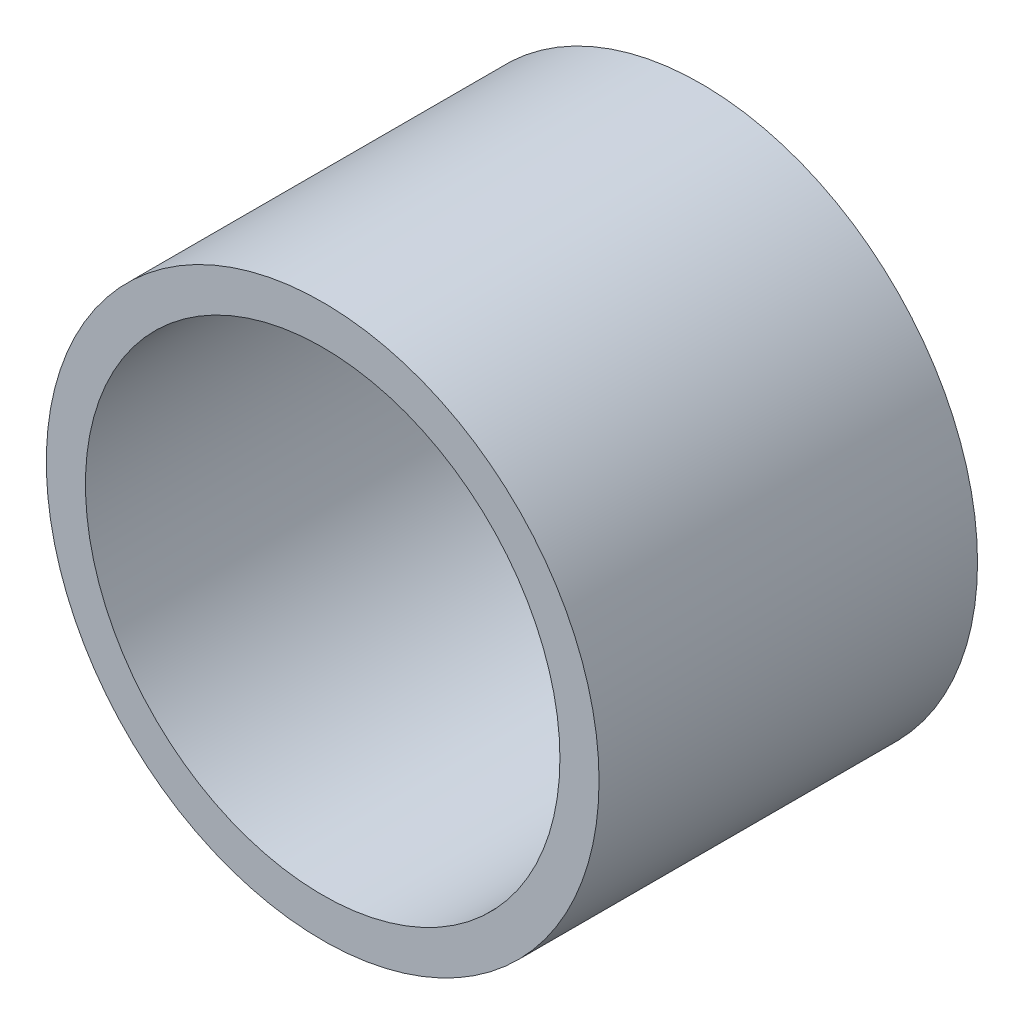
ISO-10303-21;
HEADER;
FILE_DESCRIPTION(('STEP AP214'),'2;1');
FILE_NAME('part.step','',(''),(''),'','','');
FILE_SCHEMA(('AUTOMOTIVE_DESIGN { 1 0 10303 214 1 1 1 1 }'));
ENDSEC;
DATA;
#1=APPLICATION_CONTEXT('core data for automotive mechanical design processes');
#2=APPLICATION_PROTOCOL_DEFINITION('international standard','automotive_design',2000,#1);
#3=PRODUCT_CONTEXT('',#1,'mechanical');
#4=PRODUCT('Part','Part','',(#3));
#5=PRODUCT_RELATED_PRODUCT_CATEGORY('part','',(#4));
#6=PRODUCT_DEFINITION_FORMATION('','',#4);
#7=PRODUCT_DEFINITION_CONTEXT('part definition',#1,'design');
#8=PRODUCT_DEFINITION('design','',#6,#7);
#9=PRODUCT_DEFINITION_SHAPE('','',#8);
#10=(LENGTH_UNIT() NAMED_UNIT(*) SI_UNIT(.MILLI.,.METRE.));
#11=(NAMED_UNIT(*) PLANE_ANGLE_UNIT() SI_UNIT($,.RADIAN.));
#12=(NAMED_UNIT(*) SI_UNIT($,.STERADIAN.) SOLID_ANGLE_UNIT());
#13=UNCERTAINTY_MEASURE_WITH_UNIT(LENGTH_MEASURE(1.E-05),#10,'distance_accuracy_value','');
#14=(GEOMETRIC_REPRESENTATION_CONTEXT(3) GLOBAL_UNCERTAINTY_ASSIGNED_CONTEXT((#13)) GLOBAL_UNIT_ASSIGNED_CONTEXT((#10,
#11,#12)) REPRESENTATION_CONTEXT('',''));
#15=CARTESIAN_POINT('',(0.,0.,0.));
#16=DIRECTION('',(0.,0.,1.));
#17=DIRECTION('',(1.,0.,0.));
#18=AXIS2_PLACEMENT_3D('',#15,#16,#17);
#19=CARTESIAN_POINT('',(0.,0.,50.));
#20=DIRECTION('',(0.,0.,1.));
#21=DIRECTION('',(1.,0.,0.));
#22=AXIS2_PLACEMENT_3D('',#19,#20,#21);
#23=PLANE('',#22);
#24=CARTESIAN_POINT('',(0.,0.,50.));
#25=DIRECTION('',(0.,0.,1.));
#26=DIRECTION('',(1.,0.,0.));
#27=AXIS2_PLACEMENT_3D('',#24,#25,#26);
#28=CIRCLE('',#27,36.5125);
#29=CARTESIAN_POINT('',(36.5125,0.,50.));
#30=VERTEX_POINT('',#29);
#31=EDGE_CURVE('E10',#30,#30,#28,.T.);
#32=ORIENTED_EDGE('',*,*,#31,.T.);
#33=EDGE_LOOP('',(#32));
#34=FACE_BOUND('',#33,.T.);
#35=CARTESIAN_POINT('',(0.,0.,50.));
#36=DIRECTION('',(0.,0.,1.));
#37=DIRECTION('',(1.,0.,0.));
#38=AXIS2_PLACEMENT_3D('',#35,#36,#37);
#39=CIRCLE('',#38,31.3436);
#40=CARTESIAN_POINT('',(31.3436,0.,50.));
#41=VERTEX_POINT('',#40);
#42=EDGE_CURVE('E42',#41,#41,#39,.T.);
#43=ORIENTED_EDGE('',*,*,#42,.F.);
#44=EDGE_LOOP('',(#43));
#45=FACE_BOUND('',#44,.T.);
#46=ADVANCED_FACE('F31',(#34,#45),#23,.T.);
#47=CARTESIAN_POINT('',(0.,0.,0.));
#48=DIRECTION('',(0.,0.,1.));
#49=DIRECTION('',(1.,0.,0.));
#50=AXIS2_PLACEMENT_3D('',#47,#48,#49);
#51=PLANE('',#50);
#52=CARTESIAN_POINT('',(0.,0.,0.));
#53=DIRECTION('',(0.,0.,1.));
#54=DIRECTION('',(1.,0.,0.));
#55=AXIS2_PLACEMENT_3D('',#52,#53,#54);
#56=CIRCLE('',#55,36.5125);
#57=CARTESIAN_POINT('',(36.5125,0.,0.));
#58=VERTEX_POINT('',#57);
#59=EDGE_CURVE('E35',#58,#58,#56,.T.);
#60=ORIENTED_EDGE('',*,*,#59,.F.);
#61=EDGE_LOOP('',(#60));
#62=FACE_BOUND('',#61,.T.);
#63=CARTESIAN_POINT('',(0.,0.,0.));
#64=DIRECTION('',(0.,0.,1.));
#65=DIRECTION('',(1.,0.,0.));
#66=AXIS2_PLACEMENT_3D('',#63,#64,#65);
#67=CIRCLE('',#66,31.3436);
#68=CARTESIAN_POINT('',(31.3436,0.,0.));
#69=VERTEX_POINT('',#68);
#70=EDGE_CURVE('E44',#69,#69,#67,.T.);
#71=ORIENTED_EDGE('',*,*,#70,.T.);
#72=EDGE_LOOP('',(#71));
#73=FACE_BOUND('',#72,.T.);
#74=ADVANCED_FACE('F54',(#62,#73),#51,.F.);
#75=CARTESIAN_POINT('',(0.,0.,50.));
#76=DIRECTION('',(0.,0.,-1.));
#77=DIRECTION('',(-1.,0.,0.));
#78=AXIS2_PLACEMENT_3D('',#75,#76,#77);
#79=CYLINDRICAL_SURFACE('',#78,36.5125);
#80=ORIENTED_EDGE('',*,*,#31,.F.);
#81=EDGE_LOOP('',(#80));
#82=FACE_BOUND('',#81,.T.);
#83=ORIENTED_EDGE('',*,*,#59,.T.);
#84=EDGE_LOOP('',(#83));
#85=FACE_BOUND('',#84,.T.);
#86=ADVANCED_FACE('F33',(#82,#85),#79,.T.);
#87=CARTESIAN_POINT('',(0.,0.,50.));
#88=DIRECTION('',(0.,0.,-1.));
#89=DIRECTION('',(-1.,0.,0.));
#90=AXIS2_PLACEMENT_3D('',#87,#88,#89);
#91=CYLINDRICAL_SURFACE('',#90,31.3436);
#92=ORIENTED_EDGE('',*,*,#42,.T.);
#93=EDGE_LOOP('',(#92));
#94=FACE_BOUND('',#93,.T.);
#95=ORIENTED_EDGE('',*,*,#70,.F.);
#96=EDGE_LOOP('',(#95));
#97=FACE_BOUND('',#96,.T.);
#98=ADVANCED_FACE('F50',(#94,#97),#91,.F.);
#99=CLOSED_SHELL('',(#46,#74,#86,#98));
#100=MANIFOLD_SOLID_BREP('B2',#99);
#101=ADVANCED_BREP_SHAPE_REPRESENTATION('',(#18,#100),#14);
#102=SHAPE_DEFINITION_REPRESENTATION(#9,#101);
ENDSEC;
END-ISO-10303-21;
